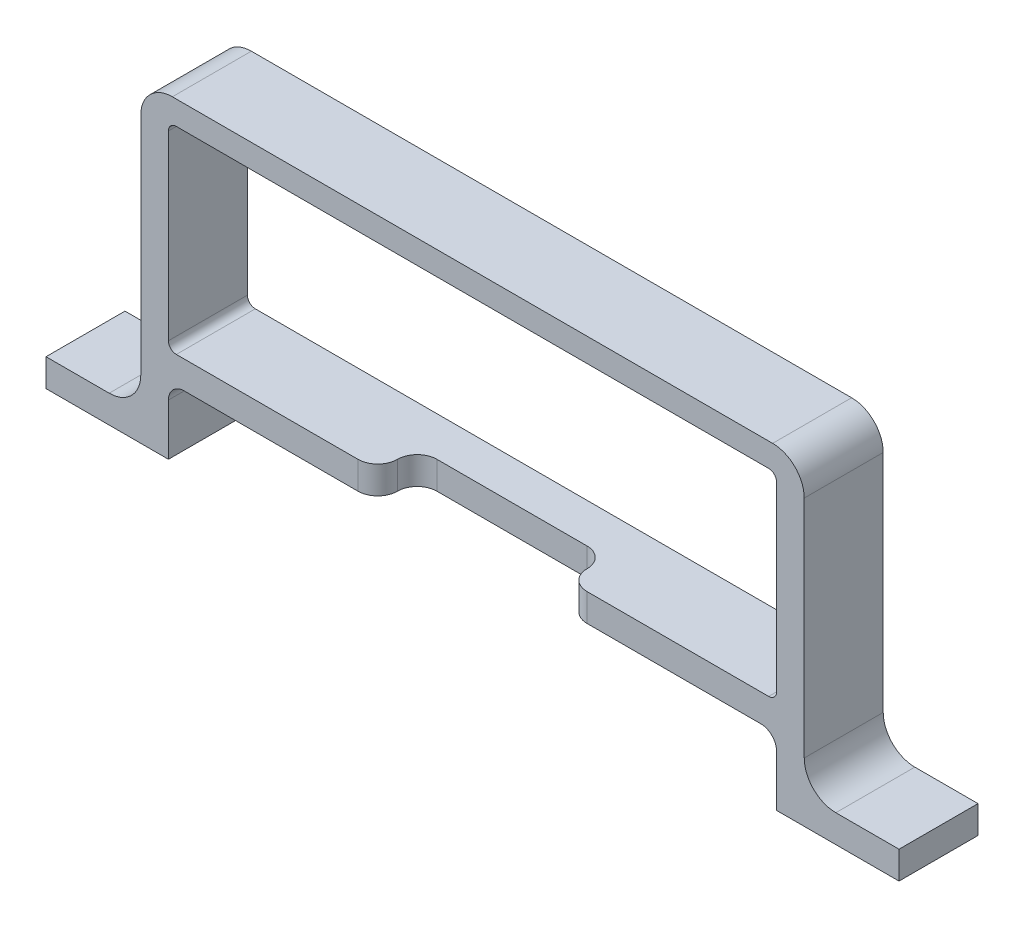
ISO-10303-21;
HEADER;
FILE_DESCRIPTION(('STEP AP214'),'2;1');
FILE_NAME('part.step','',(''),(''),'','','');
FILE_SCHEMA(('AUTOMOTIVE_DESIGN { 1 0 10303 214 1 1 1 1 }'));
ENDSEC;
DATA;
#1=APPLICATION_CONTEXT('core data for automotive mechanical design processes');
#2=APPLICATION_PROTOCOL_DEFINITION('international standard','automotive_design',2000,#1);
#3=PRODUCT_CONTEXT('',#1,'mechanical');
#4=PRODUCT('Part','Part','',(#3));
#5=PRODUCT_RELATED_PRODUCT_CATEGORY('part','',(#4));
#6=PRODUCT_DEFINITION_FORMATION('','',#4);
#7=PRODUCT_DEFINITION_CONTEXT('part definition',#1,'design');
#8=PRODUCT_DEFINITION('design','',#6,#7);
#9=PRODUCT_DEFINITION_SHAPE('','',#8);
#10=(LENGTH_UNIT() NAMED_UNIT(*) SI_UNIT(.MILLI.,.METRE.));
#11=(NAMED_UNIT(*) PLANE_ANGLE_UNIT() SI_UNIT($,.RADIAN.));
#12=(NAMED_UNIT(*) SI_UNIT($,.STERADIAN.) SOLID_ANGLE_UNIT());
#13=UNCERTAINTY_MEASURE_WITH_UNIT(LENGTH_MEASURE(1.E-05),#10,'distance_accuracy_value','');
#14=(GEOMETRIC_REPRESENTATION_CONTEXT(3) GLOBAL_UNCERTAINTY_ASSIGNED_CONTEXT((#13)) GLOBAL_UNIT_ASSIGNED_CONTEXT((#10,
#11,#12)) REPRESENTATION_CONTEXT('',''));
#15=CARTESIAN_POINT('',(0.,0.,0.));
#16=DIRECTION('',(0.,0.,1.));
#17=DIRECTION('',(1.,0.,0.));
#18=AXIS2_PLACEMENT_3D('',#15,#16,#17);
#19=CARTESIAN_POINT('',(-43.1871611587765,0.,10.));
#20=DIRECTION('',(-1.,0.,0.));
#21=DIRECTION('',(0.,0.,1.));
#22=AXIS2_PLACEMENT_3D('',#19,#20,#21);
#23=PLANE('',#22);
#24=DIRECTION('',(0.,1.,0.));
#25=VECTOR('',#24,1.);
#26=CARTESIAN_POINT('',(-43.1871611587765,0.,0.));
#27=LINE('',#26,#25);
#28=CARTESIAN_POINT('',(-43.1871611587765,-4.2455849456596,0.));
#29=VERTEX_POINT('',#28);
#30=CARTESIAN_POINT('',(-43.1871611587765,24.2544150543403,0.));
#31=VERTEX_POINT('',#30);
#32=EDGE_CURVE('E270',#29,#31,#27,.T.);
#33=ORIENTED_EDGE('',*,*,#32,.F.);
#34=DIRECTION('',(0.,0.,-1.));
#35=VECTOR('',#34,1.);
#36=CARTESIAN_POINT('',(-43.1871611587765,-4.2455849456596,10.));
#37=LINE('',#36,#35);
#38=CARTESIAN_POINT('',(-43.1871611587765,-4.2455849456596,10.));
#39=VERTEX_POINT('',#38);
#40=EDGE_CURVE('E381',#39,#29,#37,.T.);
#41=ORIENTED_EDGE('',*,*,#40,.F.);
#42=DIRECTION('',(0.,1.,0.));
#43=VECTOR('',#42,1.);
#44=CARTESIAN_POINT('',(-43.1871611587765,0.,10.));
#45=LINE('',#44,#43);
#46=CARTESIAN_POINT('',(-43.1871611587765,24.2544150543403,10.));
#47=VERTEX_POINT('',#46);
#48=EDGE_CURVE('E279',#39,#47,#45,.T.);
#49=ORIENTED_EDGE('',*,*,#48,.T.);
#50=DIRECTION('',(0.,0.,-1.));
#51=VECTOR('',#50,1.);
#52=CARTESIAN_POINT('',(-43.1871611587765,24.2544150543403,10.));
#53=LINE('',#52,#51);
#54=EDGE_CURVE('E318',#47,#31,#53,.T.);
#55=ORIENTED_EDGE('',*,*,#54,.T.);
#56=EDGE_LOOP('',(#33,#41,#49,#55));
#57=FACE_BOUND('',#56,.T.);
#58=ADVANCED_FACE('F35',(#57),#23,.T.);
#59=CARTESIAN_POINT('',(-47.1871611587765,-4.24558494565963,10.));
#60=DIRECTION('',(0.,0.,-1.));
#61=DIRECTION('',(-1.,0.,0.));
#62=AXIS2_PLACEMENT_3D('',#59,#60,#61);
#63=CYLINDRICAL_SURFACE('',#62,4.);
#64=CARTESIAN_POINT('',(-47.1871611587765,-4.24558494565963,0.));
#65=DIRECTION('',(0.,0.,1.));
#66=DIRECTION('',(1.,0.,0.));
#67=AXIS2_PLACEMENT_3D('',#64,#65,#66);
#68=CIRCLE('',#67,4.);
#69=CARTESIAN_POINT('',(-47.1871611587765,-8.24558494565963,0.));
#70=VERTEX_POINT('',#69);
#71=EDGE_CURVE('E273',#29,#70,#68,.F.);
#72=ORIENTED_EDGE('',*,*,#71,.T.);
#73=DIRECTION('',(0.,0.,-1.));
#74=VECTOR('',#73,1.);
#75=CARTESIAN_POINT('',(-47.1871611587765,-8.24558494565963,10.));
#76=LINE('',#75,#74);
#77=CARTESIAN_POINT('',(-47.1871611587765,-8.24558494565963,10.));
#78=VERTEX_POINT('',#77);
#79=EDGE_CURVE('E378',#78,#70,#76,.T.);
#80=ORIENTED_EDGE('',*,*,#79,.F.);
#81=CARTESIAN_POINT('',(-47.1871611587765,-4.24558494565963,10.));
#82=DIRECTION('',(0.,0.,1.));
#83=DIRECTION('',(1.,0.,0.));
#84=AXIS2_PLACEMENT_3D('',#81,#82,#83);
#85=CIRCLE('',#84,4.);
#86=EDGE_CURVE('E282',#39,#78,#85,.F.);
#87=ORIENTED_EDGE('',*,*,#86,.F.);
#88=ORIENTED_EDGE('',*,*,#40,.T.);
#89=EDGE_LOOP('',(#72,#80,#87,#88));
#90=FACE_BOUND('',#89,.T.);
#91=ADVANCED_FACE('F565',(#90),#63,.F.);
#92=CARTESIAN_POINT('',(0.,-8.24558494565962,10.));
#93=DIRECTION('',(0.,-1.,0.));
#94=DIRECTION('',(1.,0.,0.));
#95=AXIS2_PLACEMENT_3D('',#92,#93,#94);
#96=PLANE('',#95);
#97=DIRECTION('',(-1.,0.,0.));
#98=VECTOR('',#97,1.);
#99=CARTESIAN_POINT('',(0.,-8.24558494565962,0.));
#100=LINE('',#99,#98);
#101=CARTESIAN_POINT('',(-55.1871611587765,-8.24558494565963,0.));
#102=VERTEX_POINT('',#101);
#103=EDGE_CURVE('E321',#70,#102,#100,.T.);
#104=ORIENTED_EDGE('',*,*,#103,.T.);
#105=DIRECTION('',(0.,0.,-1.));
#106=VECTOR('',#105,1.);
#107=CARTESIAN_POINT('',(-55.1871611587765,-8.24558494565963,10.));
#108=LINE('',#107,#106);
#109=CARTESIAN_POINT('',(-55.1871611587765,-8.24558494565963,10.));
#110=VERTEX_POINT('',#109);
#111=EDGE_CURVE('E376',#110,#102,#108,.T.);
#112=ORIENTED_EDGE('',*,*,#111,.F.);
#113=DIRECTION('',(-1.,0.,0.));
#114=VECTOR('',#113,1.);
#115=CARTESIAN_POINT('',(0.,-8.24558494565962,10.));
#116=LINE('',#115,#114);
#117=EDGE_CURVE('E285',#78,#110,#116,.T.);
#118=ORIENTED_EDGE('',*,*,#117,.F.);
#119=ORIENTED_EDGE('',*,*,#79,.T.);
#120=EDGE_LOOP('',(#104,#112,#118,#119));
#121=FACE_BOUND('',#120,.T.);
#122=ADVANCED_FACE('F571',(#121),#96,.F.);
#123=CARTESIAN_POINT('',(-55.1871611587765,1.09410816039594E-13,10.));
#124=DIRECTION('',(-1.,0.,0.));
#125=DIRECTION('',(0.,-1.,0.));
#126=AXIS2_PLACEMENT_3D('',#123,#124,#125);
#127=PLANE('',#126);
#128=DIRECTION('',(0.,1.,0.));
#129=VECTOR('',#128,1.);
#130=CARTESIAN_POINT('',(-55.1871611587765,1.09410816039594E-13,0.));
#131=LINE('',#130,#129);
#132=CARTESIAN_POINT('',(-55.1871611587765,-11.7455849456596,0.));
#133=VERTEX_POINT('',#132);
#134=EDGE_CURVE('E324',#133,#102,#131,.T.);
#135=ORIENTED_EDGE('',*,*,#134,.F.);
#136=DIRECTION('',(0.,0.,-1.));
#137=VECTOR('',#136,1.);
#138=CARTESIAN_POINT('',(-55.1871611587765,-11.7455849456596,10.));
#139=LINE('',#138,#137);
#140=CARTESIAN_POINT('',(-55.1871611587765,-11.7455849456596,10.));
#141=VERTEX_POINT('',#140);
#142=EDGE_CURVE('E374',#141,#133,#139,.T.);
#143=ORIENTED_EDGE('',*,*,#142,.F.);
#144=DIRECTION('',(0.,1.,0.));
#145=VECTOR('',#144,1.);
#146=CARTESIAN_POINT('',(-55.1871611587765,1.09410816039594E-13,10.));
#147=LINE('',#146,#145);
#148=EDGE_CURVE('E287',#141,#110,#147,.T.);
#149=ORIENTED_EDGE('',*,*,#148,.T.);
#150=ORIENTED_EDGE('',*,*,#111,.T.);
#151=EDGE_LOOP('',(#135,#143,#149,#150));
#152=FACE_BOUND('',#151,.T.);
#153=ADVANCED_FACE('F828',(#152),#127,.T.);
#154=CARTESIAN_POINT('',(0.,-11.7455849456596,10.));
#155=DIRECTION('',(0.,-1.,0.));
#156=DIRECTION('',(1.,0.,0.));
#157=AXIS2_PLACEMENT_3D('',#154,#155,#156);
#158=PLANE('',#157);
#159=DIRECTION('',(-1.,0.,0.));
#160=VECTOR('',#159,1.);
#161=CARTESIAN_POINT('',(0.,-11.7455849456596,0.));
#162=LINE('',#161,#160);
#163=CARTESIAN_POINT('',(-39.6871611587765,-11.7455849456596,0.));
#164=VERTEX_POINT('',#163);
#165=EDGE_CURVE('E327',#164,#133,#162,.T.);
#166=ORIENTED_EDGE('',*,*,#165,.F.);
#167=DIRECTION('',(0.,0.,-1.));
#168=VECTOR('',#167,1.);
#169=CARTESIAN_POINT('',(-39.6871611587765,-11.7455849456596,10.));
#170=LINE('',#169,#168);
#171=CARTESIAN_POINT('',(-39.6871611587765,-11.7455849456596,10.));
#172=VERTEX_POINT('',#171);
#173=EDGE_CURVE('E372',#172,#164,#170,.T.);
#174=ORIENTED_EDGE('',*,*,#173,.F.);
#175=DIRECTION('',(-1.,0.,0.));
#176=VECTOR('',#175,1.);
#177=CARTESIAN_POINT('',(0.,-11.7455849456596,10.));
#178=LINE('',#177,#176);
#179=EDGE_CURVE('E290',#172,#141,#178,.T.);
#180=ORIENTED_EDGE('',*,*,#179,.T.);
#181=ORIENTED_EDGE('',*,*,#142,.T.);
#182=EDGE_LOOP('',(#166,#174,#180,#181));
#183=FACE_BOUND('',#182,.T.);
#184=ADVANCED_FACE('F824',(#183),#158,.T.);
#185=CARTESIAN_POINT('',(-39.6871611587765,0.,10.));
#186=DIRECTION('',(1.,0.,0.));
#187=DIRECTION('',(0.,0.,-1.));
#188=AXIS2_PLACEMENT_3D('',#185,#186,#187);
#189=PLANE('',#188);
#190=DIRECTION('',(0.,-1.,0.));
#191=VECTOR('',#190,1.);
#192=CARTESIAN_POINT('',(-39.6871611587765,0.,0.));
#193=LINE('',#192,#191);
#194=CARTESIAN_POINT('',(-39.6871611587765,-5.24558494565964,0.));
#195=VERTEX_POINT('',#194);
#196=EDGE_CURVE('E330',#195,#164,#193,.T.);
#197=ORIENTED_EDGE('',*,*,#196,.F.);
#198=DIRECTION('',(0.,0.,-1.));
#199=VECTOR('',#198,1.);
#200=CARTESIAN_POINT('',(-39.6871611587765,-5.24558494565964,10.));
#201=LINE('',#200,#199);
#202=CARTESIAN_POINT('',(-39.6871611587765,-5.24558494565964,10.));
#203=VERTEX_POINT('',#202);
#204=EDGE_CURVE('E370',#203,#195,#201,.T.);
#205=ORIENTED_EDGE('',*,*,#204,.F.);
#206=DIRECTION('',(0.,-1.,0.));
#207=VECTOR('',#206,1.);
#208=CARTESIAN_POINT('',(-39.6871611587765,0.,10.));
#209=LINE('',#208,#207);
#210=EDGE_CURVE('E293',#203,#172,#209,.T.);
#211=ORIENTED_EDGE('',*,*,#210,.T.);
#212=ORIENTED_EDGE('',*,*,#173,.T.);
#213=EDGE_LOOP('',(#197,#205,#211,#212));
#214=FACE_BOUND('',#213,.T.);
#215=ADVANCED_FACE('F822',(#214),#189,.T.);
#216=CARTESIAN_POINT('',(-37.6871611587765,-5.24558494565963,10.));
#217=DIRECTION('',(0.,0.,-1.));
#218=DIRECTION('',(-1.,0.,0.));
#219=AXIS2_PLACEMENT_3D('',#216,#217,#218);
#220=CYLINDRICAL_SURFACE('',#219,2.);
#221=CARTESIAN_POINT('',(-37.6871611587765,-5.24558494565963,0.));
#222=DIRECTION('',(0.,0.,1.));
#223=DIRECTION('',(1.,0.,0.));
#224=AXIS2_PLACEMENT_3D('',#221,#222,#223);
#225=CIRCLE('',#224,2.);
#226=CARTESIAN_POINT('',(-37.6871611587764,-3.24558494565963,0.));
#227=VERTEX_POINT('',#226);
#228=EDGE_CURVE('E333',#195,#227,#225,.F.);
#229=ORIENTED_EDGE('',*,*,#228,.T.);
#230=DIRECTION('',(0.,0.,-1.));
#231=VECTOR('',#230,1.);
#232=CARTESIAN_POINT('',(-37.6871611587764,-3.24558494565963,10.));
#233=LINE('',#232,#231);
#234=CARTESIAN_POINT('',(-37.6871611587764,-3.24558494565963,10.));
#235=VERTEX_POINT('',#234);
#236=EDGE_CURVE('E367',#235,#227,#233,.T.);
#237=ORIENTED_EDGE('',*,*,#236,.F.);
#238=CARTESIAN_POINT('',(-37.6871611587765,-5.24558494565963,10.));
#239=DIRECTION('',(0.,0.,1.));
#240=DIRECTION('',(1.,0.,0.));
#241=AXIS2_PLACEMENT_3D('',#238,#239,#240);
#242=CIRCLE('',#241,2.);
#243=EDGE_CURVE('E296',#203,#235,#242,.F.);
#244=ORIENTED_EDGE('',*,*,#243,.F.);
#245=ORIENTED_EDGE('',*,*,#204,.T.);
#246=EDGE_LOOP('',(#229,#237,#244,#245));
#247=FACE_BOUND('',#246,.T.);
#248=ADVANCED_FACE('F430',(#247),#220,.F.);
#249=CARTESIAN_POINT('',(0.,-3.24558494565963,10.));
#250=DIRECTION('',(0.,1.,0.));
#251=DIRECTION('',(0.,0.,1.));
#252=AXIS2_PLACEMENT_3D('',#249,#250,#251);
#253=PLANE('',#252);
#254=DIRECTION('',(1.,0.,0.));
#255=VECTOR('',#254,1.);
#256=CARTESIAN_POINT('',(0.,-3.24558494565963,10.));
#257=LINE('',#256,#255);
#258=CARTESIAN_POINT('',(13.3128388412235,-3.24558494565963,10.));
#259=VERTEX_POINT('',#258);
#260=CARTESIAN_POINT('',(35.3128388412235,-3.24558494565963,10.));
#261=VERTEX_POINT('',#260);
#262=EDGE_CURVE('E298',#259,#261,#257,.T.);
#263=ORIENTED_EDGE('',*,*,#262,.F.);
#264=CARTESIAN_POINT('',(13.3128388412235,-3.24558494565963,7.5));
#265=DIRECTION('',(0.,1.,0.));
#266=DIRECTION('',(0.,0.,1.));
#267=AXIS2_PLACEMENT_3D('',#264,#265,#266);
#268=CIRCLE('',#267,2.5);
#269=CARTESIAN_POINT('',(10.8128388412235,-3.24558494565963,7.5));
#270=VERTEX_POINT('',#269);
#271=EDGE_CURVE('E52',#259,#270,#268,.F.);
#272=ORIENTED_EDGE('',*,*,#271,.T.);
#273=CARTESIAN_POINT('',(8.31283884122354,-3.24558494565963,7.5));
#274=DIRECTION('',(0.,1.,0.));
#275=DIRECTION('',(0.,0.,1.));
#276=AXIS2_PLACEMENT_3D('',#273,#274,#275);
#277=CIRCLE('',#276,2.5);
#278=CARTESIAN_POINT('',(8.31283884122354,-3.24558494565963,5.));
#279=VERTEX_POINT('',#278);
#280=EDGE_CURVE('E402',#270,#279,#277,.T.);
#281=ORIENTED_EDGE('',*,*,#280,.T.);
#282=DIRECTION('',(1.,0.,0.));
#283=VECTOR('',#282,1.);
#284=CARTESIAN_POINT('',(0.,-3.24558494565963,5.));
#285=LINE('',#284,#283);
#286=CARTESIAN_POINT('',(-10.6871611587765,-3.24558494565963,5.));
#287=VERTEX_POINT('',#286);
#288=EDGE_CURVE('E411',#287,#279,#285,.T.);
#289=ORIENTED_EDGE('',*,*,#288,.F.);
#290=CARTESIAN_POINT('',(-10.6871611587765,-3.24558494565963,7.5));
#291=DIRECTION('',(0.,1.,0.));
#292=DIRECTION('',(0.,0.,1.));
#293=AXIS2_PLACEMENT_3D('',#290,#291,#292);
#294=CIRCLE('',#293,2.5);
#295=CARTESIAN_POINT('',(-13.1871611587765,-3.24558494565963,7.5));
#296=VERTEX_POINT('',#295);
#297=EDGE_CURVE('E44',#287,#296,#294,.T.);
#298=ORIENTED_EDGE('',*,*,#297,.T.);
#299=CARTESIAN_POINT('',(-15.6871611587765,-3.24558494565963,7.5));
#300=DIRECTION('',(0.,1.,0.));
#301=DIRECTION('',(0.,0.,1.));
#302=AXIS2_PLACEMENT_3D('',#299,#300,#301);
#303=CIRCLE('',#302,2.5);
#304=CARTESIAN_POINT('',(-15.6871611587765,-3.24558494565963,10.));
#305=VERTEX_POINT('',#304);
#306=EDGE_CURVE('E392',#296,#305,#303,.F.);
#307=ORIENTED_EDGE('',*,*,#306,.T.);
#308=EDGE_CURVE('E299',#235,#305,#257,.T.);
#309=ORIENTED_EDGE('',*,*,#308,.F.);
#310=ORIENTED_EDGE('',*,*,#236,.T.);
#311=DIRECTION('',(1.,0.,0.));
#312=VECTOR('',#311,1.);
#313=CARTESIAN_POINT('',(0.,-3.24558494565963,0.));
#314=LINE('',#313,#312);
#315=CARTESIAN_POINT('',(35.3128388412235,-3.24558494565963,0.));
#316=VERTEX_POINT('',#315);
#317=EDGE_CURVE('E335',#227,#316,#314,.T.);
#318=ORIENTED_EDGE('',*,*,#317,.T.);
#319=DIRECTION('',(0.,0.,-1.));
#320=VECTOR('',#319,1.);
#321=CARTESIAN_POINT('',(35.3128388412235,-3.24558494565963,10.));
#322=LINE('',#321,#320);
#323=EDGE_CURVE('E478',#261,#316,#322,.T.);
#324=ORIENTED_EDGE('',*,*,#323,.F.);
#325=EDGE_LOOP('',(#263,#272,#281,#289,#298,#307,#309,#310,#318,#324));
#326=FACE_BOUND('',#325,.T.);
#327=ADVANCED_FACE('F423',(#326),#253,.F.);
#328=CARTESIAN_POINT('',(0.,0.25441505434037,10.));
#329=DIRECTION('',(0.,-1.,0.));
#330=DIRECTION('',(0.,0.,-1.));
#331=AXIS2_PLACEMENT_3D('',#328,#329,#330);
#332=PLANE('',#331);
#333=DIRECTION('',(-1.,0.,0.));
#334=VECTOR('',#333,1.);
#335=CARTESIAN_POINT('',(10.8128388412235,0.25441505434037,5.));
#336=LINE('',#335,#334);
#337=CARTESIAN_POINT('',(8.31283884122354,0.25441505434037,5.));
#338=VERTEX_POINT('',#337);
#339=CARTESIAN_POINT('',(-10.6871611587765,0.25441505434037,5.));
#340=VERTEX_POINT('',#339);
#341=EDGE_CURVE('E406',#338,#340,#336,.T.);
#342=ORIENTED_EDGE('',*,*,#341,.F.);
#343=CARTESIAN_POINT('',(8.31283884122354,0.25441505434037,7.5));
#344=DIRECTION('',(0.,-1.,0.));
#345=DIRECTION('',(0.,0.,-1.));
#346=AXIS2_PLACEMENT_3D('',#343,#344,#345);
#347=CIRCLE('',#346,2.5);
#348=CARTESIAN_POINT('',(10.8128388412235,0.25441505434037,7.5));
#349=VERTEX_POINT('',#348);
#350=EDGE_CURVE('E400',#338,#349,#347,.T.);
#351=ORIENTED_EDGE('',*,*,#350,.T.);
#352=CARTESIAN_POINT('',(13.3128388412235,0.25441505434037,7.5));
#353=DIRECTION('',(0.,-1.,0.));
#354=DIRECTION('',(0.,0.,-1.));
#355=AXIS2_PLACEMENT_3D('',#352,#353,#354);
#356=CIRCLE('',#355,2.5);
#357=CARTESIAN_POINT('',(13.3128388412235,0.25441505434037,10.));
#358=VERTEX_POINT('',#357);
#359=EDGE_CURVE('E385',#349,#358,#356,.F.);
#360=ORIENTED_EDGE('',*,*,#359,.T.);
#361=DIRECTION('',(-1.,0.,0.));
#362=VECTOR('',#361,1.);
#363=CARTESIAN_POINT('',(0.,0.25441505434037,10.));
#364=LINE('',#363,#362);
#365=CARTESIAN_POINT('',(36.3128388412235,0.25441505434037,10.));
#366=VERTEX_POINT('',#365);
#367=EDGE_CURVE('E303',#366,#358,#364,.T.);
#368=ORIENTED_EDGE('',*,*,#367,.F.);
#369=DIRECTION('',(0.,0.,-1.));
#370=VECTOR('',#369,1.);
#371=CARTESIAN_POINT('',(36.3128388412235,0.25441505434037,10.));
#372=LINE('',#371,#370);
#373=CARTESIAN_POINT('',(36.3128388412235,0.25441505434037,0.));
#374=VERTEX_POINT('',#373);
#375=EDGE_CURVE('E480',#366,#374,#372,.T.);
#376=ORIENTED_EDGE('',*,*,#375,.T.);
#377=DIRECTION('',(-1.,0.,0.));
#378=VECTOR('',#377,1.);
#379=CARTESIAN_POINT('',(0.,0.25441505434037,0.));
#380=LINE('',#379,#378);
#381=CARTESIAN_POINT('',(-38.6871611587765,0.25441505434037,0.));
#382=VERTEX_POINT('',#381);
#383=EDGE_CURVE('E337',#374,#382,#380,.T.);
#384=ORIENTED_EDGE('',*,*,#383,.T.);
#385=DIRECTION('',(0.,0.,-1.));
#386=VECTOR('',#385,1.);
#387=CARTESIAN_POINT('',(-38.6871611587765,0.25441505434037,10.));
#388=LINE('',#387,#386);
#389=CARTESIAN_POINT('',(-38.6871611587765,0.25441505434037,10.));
#390=VERTEX_POINT('',#389);
#391=EDGE_CURVE('E365',#390,#382,#388,.T.);
#392=ORIENTED_EDGE('',*,*,#391,.F.);
#393=CARTESIAN_POINT('',(-15.6871611587765,0.25441505434037,10.));
#394=VERTEX_POINT('',#393);
#395=EDGE_CURVE('E302',#394,#390,#364,.T.);
#396=ORIENTED_EDGE('',*,*,#395,.F.);
#397=CARTESIAN_POINT('',(-15.6871611587765,0.25441505434037,7.5));
#398=DIRECTION('',(0.,-1.,0.));
#399=DIRECTION('',(0.,0.,-1.));
#400=AXIS2_PLACEMENT_3D('',#397,#398,#399);
#401=CIRCLE('',#400,2.5);
#402=CARTESIAN_POINT('',(-13.1871611587765,0.25441505434037,7.5));
#403=VERTEX_POINT('',#402);
#404=EDGE_CURVE('E383',#394,#403,#401,.F.);
#405=ORIENTED_EDGE('',*,*,#404,.T.);
#406=CARTESIAN_POINT('',(-10.6871611587765,0.25441505434037,7.5));
#407=DIRECTION('',(0.,-1.,0.));
#408=DIRECTION('',(0.,0.,-1.));
#409=AXIS2_PLACEMENT_3D('',#406,#407,#408);
#410=CIRCLE('',#409,2.5);
#411=EDGE_CURVE('E11',#403,#340,#410,.T.);
#412=ORIENTED_EDGE('',*,*,#411,.T.);
#413=EDGE_LOOP('',(#342,#351,#360,#368,#376,#384,#392,#396,#405,#412));
#414=FACE_BOUND('',#413,.T.);
#415=ADVANCED_FACE('F536',(#414),#332,.F.);
#416=CARTESIAN_POINT('',(-38.6871611587765,1.25441505434037,10.));
#417=DIRECTION('',(0.,0.,-1.));
#418=DIRECTION('',(-1.,0.,0.));
#419=AXIS2_PLACEMENT_3D('',#416,#417,#418);
#420=CYLINDRICAL_SURFACE('',#419,1.);
#421=CARTESIAN_POINT('',(-38.6871611587765,1.25441505434037,0.));
#422=DIRECTION('',(0.,0.,1.));
#423=DIRECTION('',(1.,0.,0.));
#424=AXIS2_PLACEMENT_3D('',#421,#422,#423);
#425=CIRCLE('',#424,1.);
#426=CARTESIAN_POINT('',(-39.6871611587765,1.25441505434037,0.));
#427=VERTEX_POINT('',#426);
#428=EDGE_CURVE('E340',#427,#382,#425,.T.);
#429=ORIENTED_EDGE('',*,*,#428,.F.);
#430=DIRECTION('',(0.,0.,-1.));
#431=VECTOR('',#430,1.);
#432=CARTESIAN_POINT('',(-39.6871611587765,1.25441505434037,10.));
#433=LINE('',#432,#431);
#434=CARTESIAN_POINT('',(-39.6871611587765,1.25441505434037,10.));
#435=VERTEX_POINT('',#434);
#436=EDGE_CURVE('E363',#435,#427,#433,.T.);
#437=ORIENTED_EDGE('',*,*,#436,.F.);
#438=CARTESIAN_POINT('',(-38.6871611587765,1.25441505434037,10.));
#439=DIRECTION('',(0.,0.,1.));
#440=DIRECTION('',(1.,0.,0.));
#441=AXIS2_PLACEMENT_3D('',#438,#439,#440);
#442=CIRCLE('',#441,1.);
#443=EDGE_CURVE('E305',#435,#390,#442,.T.);
#444=ORIENTED_EDGE('',*,*,#443,.T.);
#445=ORIENTED_EDGE('',*,*,#391,.T.);
#446=EDGE_LOOP('',(#429,#437,#444,#445));
#447=FACE_BOUND('',#446,.T.);
#448=ADVANCED_FACE('F543',(#447),#420,.F.);
#449=CARTESIAN_POINT('',(-39.6871611587765,0.,10.));
#450=DIRECTION('',(-1.,0.,0.));
#451=DIRECTION('',(0.,0.,1.));
#452=AXIS2_PLACEMENT_3D('',#449,#450,#451);
#453=PLANE('',#452);
#454=DIRECTION('',(0.,1.,0.));
#455=VECTOR('',#454,1.);
#456=CARTESIAN_POINT('',(-39.6871611587765,0.,0.));
#457=LINE('',#456,#455);
#458=CARTESIAN_POINT('',(-39.6871611587765,24.2544150543404,0.));
#459=VERTEX_POINT('',#458);
#460=EDGE_CURVE('E343',#427,#459,#457,.T.);
#461=ORIENTED_EDGE('',*,*,#460,.T.);
#462=DIRECTION('',(0.,0.,-1.));
#463=VECTOR('',#462,1.);
#464=CARTESIAN_POINT('',(-39.6871611587765,24.2544150543404,10.));
#465=LINE('',#464,#463);
#466=CARTESIAN_POINT('',(-39.6871611587765,24.2544150543404,10.));
#467=VERTEX_POINT('',#466);
#468=EDGE_CURVE('E360',#467,#459,#465,.T.);
#469=ORIENTED_EDGE('',*,*,#468,.F.);
#470=DIRECTION('',(0.,1.,0.));
#471=VECTOR('',#470,1.);
#472=CARTESIAN_POINT('',(-39.6871611587765,0.,10.));
#473=LINE('',#472,#471);
#474=EDGE_CURVE('E308',#435,#467,#473,.T.);
#475=ORIENTED_EDGE('',*,*,#474,.F.);
#476=ORIENTED_EDGE('',*,*,#436,.T.);
#477=EDGE_LOOP('',(#461,#469,#475,#476));
#478=FACE_BOUND('',#477,.T.);
#479=ADVANCED_FACE('F546',(#478),#453,.F.);
#480=CARTESIAN_POINT('',(-38.6871611587765,24.2544150543404,10.));
#481=DIRECTION('',(0.,0.,-1.));
#482=DIRECTION('',(-1.,0.,0.));
#483=AXIS2_PLACEMENT_3D('',#480,#481,#482);
#484=CYLINDRICAL_SURFACE('',#483,1.);
#485=CARTESIAN_POINT('',(-38.6871611587765,24.2544150543404,0.));
#486=DIRECTION('',(0.,0.,1.));
#487=DIRECTION('',(1.,0.,0.));
#488=AXIS2_PLACEMENT_3D('',#485,#486,#487);
#489=CIRCLE('',#488,1.);
#490=CARTESIAN_POINT('',(-38.6871611587765,25.2544150543404,0.));
#491=VERTEX_POINT('',#490);
#492=EDGE_CURVE('E345',#459,#491,#489,.F.);
#493=ORIENTED_EDGE('',*,*,#492,.T.);
#494=DIRECTION('',(0.,0.,-1.));
#495=VECTOR('',#494,1.);
#496=CARTESIAN_POINT('',(-38.6871611587765,25.2544150543404,10.));
#497=LINE('',#496,#495);
#498=CARTESIAN_POINT('',(-38.6871611587765,25.2544150543404,10.));
#499=VERTEX_POINT('',#498);
#500=EDGE_CURVE('E357',#499,#491,#497,.T.);
#501=ORIENTED_EDGE('',*,*,#500,.F.);
#502=CARTESIAN_POINT('',(-38.6871611587765,24.2544150543404,10.));
#503=DIRECTION('',(0.,0.,1.));
#504=DIRECTION('',(1.,0.,0.));
#505=AXIS2_PLACEMENT_3D('',#502,#503,#504);
#506=CIRCLE('',#505,1.);
#507=EDGE_CURVE('E310',#467,#499,#506,.F.);
#508=ORIENTED_EDGE('',*,*,#507,.F.);
#509=ORIENTED_EDGE('',*,*,#468,.T.);
#510=EDGE_LOOP('',(#493,#501,#508,#509));
#511=FACE_BOUND('',#510,.T.);
#512=ADVANCED_FACE('F550',(#511),#484,.F.);
#513=CARTESIAN_POINT('',(0.,25.2544150543404,10.));
#514=DIRECTION('',(0.,1.,0.));
#515=DIRECTION('',(0.,0.,1.));
#516=AXIS2_PLACEMENT_3D('',#513,#514,#515);
#517=PLANE('',#516);
#518=DIRECTION('',(1.,0.,0.));
#519=VECTOR('',#518,1.);
#520=CARTESIAN_POINT('',(0.,25.2544150543404,0.));
#521=LINE('',#520,#519);
#522=CARTESIAN_POINT('',(36.3128388412235,25.2544150543404,0.));
#523=VERTEX_POINT('',#522);
#524=EDGE_CURVE('E347',#491,#523,#521,.T.);
#525=ORIENTED_EDGE('',*,*,#524,.T.);
#526=DIRECTION('',(0.,0.,-1.));
#527=VECTOR('',#526,1.);
#528=CARTESIAN_POINT('',(36.3128388412235,25.2544150543404,10.));
#529=LINE('',#528,#527);
#530=CARTESIAN_POINT('',(36.3128388412235,25.2544150543404,10.));
#531=VERTEX_POINT('',#530);
#532=EDGE_CURVE('E275',#531,#523,#529,.T.);
#533=ORIENTED_EDGE('',*,*,#532,.F.);
#534=DIRECTION('',(1.,0.,0.));
#535=VECTOR('',#534,1.);
#536=CARTESIAN_POINT('',(0.,25.2544150543404,10.));
#537=LINE('',#536,#535);
#538=EDGE_CURVE('E312',#499,#531,#537,.T.);
#539=ORIENTED_EDGE('',*,*,#538,.F.);
#540=ORIENTED_EDGE('',*,*,#500,.T.);
#541=EDGE_LOOP('',(#525,#533,#539,#540));
#542=FACE_BOUND('',#541,.T.);
#543=ADVANCED_FACE('F552',(#542),#517,.F.);
#544=CARTESIAN_POINT('',(0.,28.2544150543404,10.));
#545=DIRECTION('',(0.,-1.,0.));
#546=DIRECTION('',(0.,0.,-1.));
#547=AXIS2_PLACEMENT_3D('',#544,#545,#546);
#548=PLANE('',#547);
#549=DIRECTION('',(-1.,0.,0.));
#550=VECTOR('',#549,1.);
#551=CARTESIAN_POINT('',(0.,28.2544150543404,0.));
#552=LINE('',#551,#550);
#553=CARTESIAN_POINT('',(36.8128388412235,28.2544150543404,0.));
#554=VERTEX_POINT('',#553);
#555=CARTESIAN_POINT('',(-39.1871611587764,28.2544150543404,0.));
#556=VERTEX_POINT('',#555);
#557=EDGE_CURVE('E349',#554,#556,#552,.T.);
#558=ORIENTED_EDGE('',*,*,#557,.T.);
#559=DIRECTION('',(0.,0.,-1.));
#560=VECTOR('',#559,1.);
#561=CARTESIAN_POINT('',(-39.1871611587764,28.2544150543404,10.));
#562=LINE('',#561,#560);
#563=CARTESIAN_POINT('',(-39.1871611587764,28.2544150543404,10.));
#564=VERTEX_POINT('',#563);
#565=EDGE_CURVE('E355',#564,#556,#562,.T.);
#566=ORIENTED_EDGE('',*,*,#565,.F.);
#567=DIRECTION('',(-1.,0.,0.));
#568=VECTOR('',#567,1.);
#569=CARTESIAN_POINT('',(0.,28.2544150543404,10.));
#570=LINE('',#569,#568);
#571=CARTESIAN_POINT('',(36.8128388412235,28.2544150543404,10.));
#572=VERTEX_POINT('',#571);
#573=EDGE_CURVE('E314',#572,#564,#570,.T.);
#574=ORIENTED_EDGE('',*,*,#573,.F.);
#575=DIRECTION('',(0.,0.,-1.));
#576=VECTOR('',#575,1.);
#577=CARTESIAN_POINT('',(36.8128388412235,28.2544150543404,10.));
#578=LINE('',#577,#576);
#579=EDGE_CURVE('E252',#572,#554,#578,.T.);
#580=ORIENTED_EDGE('',*,*,#579,.T.);
#581=EDGE_LOOP('',(#558,#566,#574,#580));
#582=FACE_BOUND('',#581,.T.);
#583=ADVANCED_FACE('F554',(#582),#548,.F.);
#584=CARTESIAN_POINT('',(-39.1871611587765,24.2544150543404,10.));
#585=DIRECTION('',(0.,0.,-1.));
#586=DIRECTION('',(-1.,0.,0.));
#587=AXIS2_PLACEMENT_3D('',#584,#585,#586);
#588=CYLINDRICAL_SURFACE('',#587,4.);
#589=CARTESIAN_POINT('',(-39.1871611587765,24.2544150543404,0.));
#590=DIRECTION('',(0.,0.,1.));
#591=DIRECTION('',(1.,0.,0.));
#592=AXIS2_PLACEMENT_3D('',#589,#590,#591);
#593=CIRCLE('',#592,4.);
#594=EDGE_CURVE('E283',#31,#556,#593,.F.);
#595=ORIENTED_EDGE('',*,*,#594,.F.);
#596=ORIENTED_EDGE('',*,*,#54,.F.);
#597=CARTESIAN_POINT('',(-39.1871611587765,24.2544150543404,10.));
#598=DIRECTION('',(0.,0.,1.));
#599=DIRECTION('',(1.,0.,0.));
#600=AXIS2_PLACEMENT_3D('',#597,#598,#599);
#601=CIRCLE('',#600,4.);
#602=EDGE_CURVE('E316',#47,#564,#601,.F.);
#603=ORIENTED_EDGE('',*,*,#602,.T.);
#604=ORIENTED_EDGE('',*,*,#565,.T.);
#605=EDGE_LOOP('',(#595,#596,#603,#604));
#606=FACE_BOUND('',#605,.T.);
#607=ADVANCED_FACE('F560',(#606),#588,.T.);
#608=CARTESIAN_POINT('',(0.,0.,10.));
#609=DIRECTION('',(0.,0.,1.));
#610=DIRECTION('',(1.,0.,0.));
#611=AXIS2_PLACEMENT_3D('',#608,#609,#610);
#612=PLANE('',#611);
#613=ORIENTED_EDGE('',*,*,#367,.T.);
#614=DIRECTION('',(0.,1.,0.));
#615=VECTOR('',#614,1.);
#616=CARTESIAN_POINT('',(13.3128388412235,-3.24558494565963,10.));
#617=LINE('',#616,#615);
#618=EDGE_CURVE('E389',#358,#259,#617,.F.);
#619=ORIENTED_EDGE('',*,*,#618,.T.);
#620=ORIENTED_EDGE('',*,*,#262,.T.);
#621=CARTESIAN_POINT('',(35.3128388412235,-5.24558494565963,10.));
#622=DIRECTION('',(0.,0.,-1.));
#623=DIRECTION('',(-1.,0.,0.));
#624=AXIS2_PLACEMENT_3D('',#621,#622,#623);
#625=CIRCLE('',#624,2.);
#626=CARTESIAN_POINT('',(37.3128388412235,-5.24558494565964,10.));
#627=VERTEX_POINT('',#626);
#628=EDGE_CURVE('E517',#627,#261,#625,.F.);
#629=ORIENTED_EDGE('',*,*,#628,.F.);
#630=DIRECTION('',(0.,-1.,0.));
#631=VECTOR('',#630,1.);
#632=CARTESIAN_POINT('',(37.3128388412235,0.,10.));
#633=LINE('',#632,#631);
#634=CARTESIAN_POINT('',(37.3128388412235,-11.7455849456596,10.));
#635=VERTEX_POINT('',#634);
#636=EDGE_CURVE('E515',#627,#635,#633,.T.);
#637=ORIENTED_EDGE('',*,*,#636,.T.);
#638=DIRECTION('',(1.,0.,0.));
#639=VECTOR('',#638,1.);
#640=CARTESIAN_POINT('',(-2.37432231755293,-11.7455849456596,10.));
#641=LINE('',#640,#639);
#642=CARTESIAN_POINT('',(52.8128388412236,-11.7455849456596,10.));
#643=VERTEX_POINT('',#642);
#644=EDGE_CURVE('E513',#635,#643,#641,.T.);
#645=ORIENTED_EDGE('',*,*,#644,.T.);
#646=DIRECTION('',(0.,1.,0.));
#647=VECTOR('',#646,1.);
#648=CARTESIAN_POINT('',(52.8128388412235,1.09410816039594E-13,10.));
#649=LINE('',#648,#647);
#650=CARTESIAN_POINT('',(52.8128388412235,-8.24558494565963,10.));
#651=VERTEX_POINT('',#650);
#652=EDGE_CURVE('E511',#643,#651,#649,.T.);
#653=ORIENTED_EDGE('',*,*,#652,.T.);
#654=DIRECTION('',(1.,0.,0.));
#655=VECTOR('',#654,1.);
#656=CARTESIAN_POINT('',(-2.37432231755293,-8.24558494565962,10.));
#657=LINE('',#656,#655);
#658=CARTESIAN_POINT('',(44.8128388412236,-8.24558494565963,10.));
#659=VERTEX_POINT('',#658);
#660=EDGE_CURVE('E508',#659,#651,#657,.T.);
#661=ORIENTED_EDGE('',*,*,#660,.F.);
#662=CARTESIAN_POINT('',(44.8128388412235,-4.24558494565963,10.));
#663=DIRECTION('',(0.,0.,-1.));
#664=DIRECTION('',(-1.,0.,0.));
#665=AXIS2_PLACEMENT_3D('',#662,#663,#664);
#666=CIRCLE('',#665,4.);
#667=CARTESIAN_POINT('',(40.8128388412235,-4.2455849456596,10.));
#668=VERTEX_POINT('',#667);
#669=EDGE_CURVE('E263',#668,#659,#666,.F.);
#670=ORIENTED_EDGE('',*,*,#669,.F.);
#671=DIRECTION('',(0.,1.,0.));
#672=VECTOR('',#671,1.);
#673=CARTESIAN_POINT('',(40.8128388412235,0.,10.));
#674=LINE('',#673,#672);
#675=CARTESIAN_POINT('',(40.8128388412235,24.2544150543403,10.));
#676=VERTEX_POINT('',#675);
#677=EDGE_CURVE('E255',#668,#676,#674,.T.);
#678=ORIENTED_EDGE('',*,*,#677,.T.);
#679=CARTESIAN_POINT('',(36.8128388412235,24.2544150543404,10.));
#680=DIRECTION('',(0.,0.,-1.));
#681=DIRECTION('',(-1.,0.,0.));
#682=AXIS2_PLACEMENT_3D('',#679,#680,#681);
#683=CIRCLE('',#682,4.);
#684=EDGE_CURVE('E244',#676,#572,#683,.F.);
#685=ORIENTED_EDGE('',*,*,#684,.T.);
#686=ORIENTED_EDGE('',*,*,#573,.T.);
#687=ORIENTED_EDGE('',*,*,#602,.F.);
#688=ORIENTED_EDGE('',*,*,#48,.F.);
#689=ORIENTED_EDGE('',*,*,#86,.T.);
#690=ORIENTED_EDGE('',*,*,#117,.T.);
#691=ORIENTED_EDGE('',*,*,#148,.F.);
#692=ORIENTED_EDGE('',*,*,#179,.F.);
#693=ORIENTED_EDGE('',*,*,#210,.F.);
#694=ORIENTED_EDGE('',*,*,#243,.T.);
#695=ORIENTED_EDGE('',*,*,#308,.T.);
#696=DIRECTION('',(0.,-1.,0.));
#697=VECTOR('',#696,1.);
#698=CARTESIAN_POINT('',(-15.6871611587765,0.25441505434037,10.));
#699=LINE('',#698,#697);
#700=EDGE_CURVE('E387',#305,#394,#699,.F.);
#701=ORIENTED_EDGE('',*,*,#700,.T.);
#702=ORIENTED_EDGE('',*,*,#395,.T.);
#703=ORIENTED_EDGE('',*,*,#443,.F.);
#704=ORIENTED_EDGE('',*,*,#474,.T.);
#705=ORIENTED_EDGE('',*,*,#507,.T.);
#706=ORIENTED_EDGE('',*,*,#538,.T.);
#707=CARTESIAN_POINT('',(36.3128388412235,24.2544150543404,10.));
#708=DIRECTION('',(0.,0.,-1.));
#709=DIRECTION('',(-1.,0.,0.));
#710=AXIS2_PLACEMENT_3D('',#707,#708,#709);
#711=CIRCLE('',#710,1.);
#712=CARTESIAN_POINT('',(37.3128388412235,24.2544150543404,10.));
#713=VERTEX_POINT('',#712);
#714=EDGE_CURVE('E254',#713,#531,#711,.F.);
#715=ORIENTED_EDGE('',*,*,#714,.F.);
#716=DIRECTION('',(0.,1.,0.));
#717=VECTOR('',#716,1.);
#718=CARTESIAN_POINT('',(37.3128388412235,0.,10.));
#719=LINE('',#718,#717);
#720=CARTESIAN_POINT('',(37.3128388412235,1.25441505434037,10.));
#721=VERTEX_POINT('',#720);
#722=EDGE_CURVE('E523',#721,#713,#719,.T.);
#723=ORIENTED_EDGE('',*,*,#722,.F.);
#724=CARTESIAN_POINT('',(36.3128388412235,1.25441505434037,10.));
#725=DIRECTION('',(0.,0.,-1.));
#726=DIRECTION('',(-1.,0.,0.));
#727=AXIS2_PLACEMENT_3D('',#724,#725,#726);
#728=CIRCLE('',#727,1.);
#729=EDGE_CURVE('E520',#721,#366,#728,.T.);
#730=ORIENTED_EDGE('',*,*,#729,.T.);
#731=EDGE_LOOP('',(#613,#619,#620,#629,#637,#645,#653,#661,#670,#678,#685,#686,#687,#688,#689,
#690,#691,#692,#693,#694,#695,#701,#702,#703,#704,#705,#706,#715,#723,#730));
#732=FACE_BOUND('',#731,.T.);
#733=ADVANCED_FACE('F260',(#732),#612,.T.);
#734=CARTESIAN_POINT('',(0.,0.,0.));
#735=DIRECTION('',(0.,0.,1.));
#736=DIRECTION('',(1.,0.,0.));
#737=AXIS2_PLACEMENT_3D('',#734,#735,#736);
#738=PLANE('',#737);
#739=ORIENTED_EDGE('',*,*,#557,.F.);
#740=CARTESIAN_POINT('',(36.8128388412235,24.2544150543404,0.));
#741=DIRECTION('',(0.,0.,-1.));
#742=DIRECTION('',(-1.,0.,0.));
#743=AXIS2_PLACEMENT_3D('',#740,#741,#742);
#744=CIRCLE('',#743,4.);
#745=CARTESIAN_POINT('',(40.8128388412235,24.2544150543403,0.));
#746=VERTEX_POINT('',#745);
#747=EDGE_CURVE('E502',#746,#554,#744,.F.);
#748=ORIENTED_EDGE('',*,*,#747,.F.);
#749=DIRECTION('',(0.,1.,0.));
#750=VECTOR('',#749,1.);
#751=CARTESIAN_POINT('',(40.8128388412235,0.,0.));
#752=LINE('',#751,#750);
#753=CARTESIAN_POINT('',(40.8128388412235,-4.2455849456596,0.));
#754=VERTEX_POINT('',#753);
#755=EDGE_CURVE('E269',#754,#746,#752,.T.);
#756=ORIENTED_EDGE('',*,*,#755,.F.);
#757=CARTESIAN_POINT('',(44.8128388412235,-4.24558494565963,0.));
#758=DIRECTION('',(0.,0.,-1.));
#759=DIRECTION('',(-1.,0.,0.));
#760=AXIS2_PLACEMENT_3D('',#757,#758,#759);
#761=CIRCLE('',#760,4.);
#762=CARTESIAN_POINT('',(44.8128388412236,-8.24558494565963,0.));
#763=VERTEX_POINT('',#762);
#764=EDGE_CURVE('E265',#754,#763,#761,.F.);
#765=ORIENTED_EDGE('',*,*,#764,.T.);
#766=DIRECTION('',(1.,0.,0.));
#767=VECTOR('',#766,1.);
#768=CARTESIAN_POINT('',(-2.37432231755293,-8.24558494565962,0.));
#769=LINE('',#768,#767);
#770=CARTESIAN_POINT('',(52.8128388412235,-8.24558494565963,0.));
#771=VERTEX_POINT('',#770);
#772=EDGE_CURVE('E459',#763,#771,#769,.T.);
#773=ORIENTED_EDGE('',*,*,#772,.T.);
#774=DIRECTION('',(0.,1.,0.));
#775=VECTOR('',#774,1.);
#776=CARTESIAN_POINT('',(52.8128388412235,1.09410816039594E-13,0.));
#777=LINE('',#776,#775);
#778=CARTESIAN_POINT('',(52.8128388412236,-11.7455849456596,0.));
#779=VERTEX_POINT('',#778);
#780=EDGE_CURVE('E456',#779,#771,#777,.T.);
#781=ORIENTED_EDGE('',*,*,#780,.F.);
#782=DIRECTION('',(1.,0.,0.));
#783=VECTOR('',#782,1.);
#784=CARTESIAN_POINT('',(-2.37432231755293,-11.7455849456596,0.));
#785=LINE('',#784,#783);
#786=CARTESIAN_POINT('',(37.3128388412235,-11.7455849456596,0.));
#787=VERTEX_POINT('',#786);
#788=EDGE_CURVE('E448',#787,#779,#785,.T.);
#789=ORIENTED_EDGE('',*,*,#788,.F.);
#790=DIRECTION('',(0.,-1.,0.));
#791=VECTOR('',#790,1.);
#792=CARTESIAN_POINT('',(37.3128388412235,0.,0.));
#793=LINE('',#792,#791);
#794=CARTESIAN_POINT('',(37.3128388412235,-5.24558494565964,0.));
#795=VERTEX_POINT('',#794);
#796=EDGE_CURVE('E444',#795,#787,#793,.T.);
#797=ORIENTED_EDGE('',*,*,#796,.F.);
#798=CARTESIAN_POINT('',(35.3128388412235,-5.24558494565963,0.));
#799=DIRECTION('',(0.,0.,-1.));
#800=DIRECTION('',(-1.,0.,0.));
#801=AXIS2_PLACEMENT_3D('',#798,#799,#800);
#802=CIRCLE('',#801,2.);
#803=EDGE_CURVE('E442',#795,#316,#802,.F.);
#804=ORIENTED_EDGE('',*,*,#803,.T.);
#805=ORIENTED_EDGE('',*,*,#317,.F.);
#806=ORIENTED_EDGE('',*,*,#228,.F.);
#807=ORIENTED_EDGE('',*,*,#196,.T.);
#808=ORIENTED_EDGE('',*,*,#165,.T.);
#809=ORIENTED_EDGE('',*,*,#134,.T.);
#810=ORIENTED_EDGE('',*,*,#103,.F.);
#811=ORIENTED_EDGE('',*,*,#71,.F.);
#812=ORIENTED_EDGE('',*,*,#32,.T.);
#813=ORIENTED_EDGE('',*,*,#594,.T.);
#814=EDGE_LOOP('',(#739,#748,#756,#765,#773,#781,#789,#797,#804,#805,#806,#807,#808,#809,#810,
#811,#812,#813));
#815=FACE_BOUND('',#814,.T.);
#816=CARTESIAN_POINT('',(36.3128388412235,24.2544150543404,0.));
#817=DIRECTION('',(0.,0.,-1.));
#818=DIRECTION('',(-1.,0.,0.));
#819=AXIS2_PLACEMENT_3D('',#816,#817,#818);
#820=CIRCLE('',#819,1.);
#821=CARTESIAN_POINT('',(37.3128388412235,24.2544150543404,0.));
#822=VERTEX_POINT('',#821);
#823=EDGE_CURVE('E493',#822,#523,#820,.F.);
#824=ORIENTED_EDGE('',*,*,#823,.T.);
#825=ORIENTED_EDGE('',*,*,#524,.F.);
#826=ORIENTED_EDGE('',*,*,#492,.F.);
#827=ORIENTED_EDGE('',*,*,#460,.F.);
#828=ORIENTED_EDGE('',*,*,#428,.T.);
#829=ORIENTED_EDGE('',*,*,#383,.F.);
#830=CARTESIAN_POINT('',(36.3128388412235,1.25441505434037,0.));
#831=DIRECTION('',(0.,0.,-1.));
#832=DIRECTION('',(-1.,0.,0.));
#833=AXIS2_PLACEMENT_3D('',#830,#831,#832);
#834=CIRCLE('',#833,1.);
#835=CARTESIAN_POINT('',(37.3128388412235,1.25441505434037,0.));
#836=VERTEX_POINT('',#835);
#837=EDGE_CURVE('E446',#836,#374,#834,.T.);
#838=ORIENTED_EDGE('',*,*,#837,.F.);
#839=DIRECTION('',(0.,1.,0.));
#840=VECTOR('',#839,1.);
#841=CARTESIAN_POINT('',(37.3128388412235,0.,0.));
#842=LINE('',#841,#840);
#843=EDGE_CURVE('E451',#836,#822,#842,.T.);
#844=ORIENTED_EDGE('',*,*,#843,.T.);
#845=EDGE_LOOP('',(#824,#825,#826,#827,#828,#829,#838,#844));
#846=FACE_BOUND('',#845,.T.);
#847=ADVANCED_FACE('F437',(#815,#846),#738,.F.);
#848=CARTESIAN_POINT('',(40.8128388412235,0.,10.));
#849=DIRECTION('',(-1.,0.,0.));
#850=DIRECTION('',(0.,0.,1.));
#851=AXIS2_PLACEMENT_3D('',#848,#849,#850);
#852=PLANE('',#851);
#853=ORIENTED_EDGE('',*,*,#755,.T.);
#854=DIRECTION('',(0.,0.,-1.));
#855=VECTOR('',#854,1.);
#856=CARTESIAN_POINT('',(40.8128388412235,24.2544150543403,10.));
#857=LINE('',#856,#855);
#858=EDGE_CURVE('E249',#676,#746,#857,.T.);
#859=ORIENTED_EDGE('',*,*,#858,.F.);
#860=ORIENTED_EDGE('',*,*,#677,.F.);
#861=DIRECTION('',(0.,0.,-1.));
#862=VECTOR('',#861,1.);
#863=CARTESIAN_POINT('',(40.8128388412235,-4.2455849456596,10.));
#864=LINE('',#863,#862);
#865=EDGE_CURVE('E464',#668,#754,#864,.T.);
#866=ORIENTED_EDGE('',*,*,#865,.T.);
#867=EDGE_LOOP('',(#853,#859,#860,#866));
#868=FACE_BOUND('',#867,.T.);
#869=ADVANCED_FACE('F267',(#868),#852,.F.);
#870=CARTESIAN_POINT('',(36.8128388412235,24.2544150543404,10.));
#871=DIRECTION('',(0.,0.,-1.));
#872=DIRECTION('',(-1.,0.,0.));
#873=AXIS2_PLACEMENT_3D('',#870,#871,#872);
#874=CYLINDRICAL_SURFACE('',#873,4.);
#875=ORIENTED_EDGE('',*,*,#747,.T.);
#876=ORIENTED_EDGE('',*,*,#579,.F.);
#877=ORIENTED_EDGE('',*,*,#684,.F.);
#878=ORIENTED_EDGE('',*,*,#858,.T.);
#879=EDGE_LOOP('',(#875,#876,#877,#878));
#880=FACE_BOUND('',#879,.T.);
#881=ADVANCED_FACE('F247',(#880),#874,.T.);
#882=CARTESIAN_POINT('',(36.3128388412235,24.2544150543404,10.));
#883=DIRECTION('',(0.,0.,-1.));
#884=DIRECTION('',(-1.,0.,0.));
#885=AXIS2_PLACEMENT_3D('',#882,#883,#884);
#886=CYLINDRICAL_SURFACE('',#885,1.);
#887=ORIENTED_EDGE('',*,*,#823,.F.);
#888=DIRECTION('',(0.,0.,-1.));
#889=VECTOR('',#888,1.);
#890=CARTESIAN_POINT('',(37.3128388412235,24.2544150543404,10.));
#891=LINE('',#890,#889);
#892=EDGE_CURVE('E485',#713,#822,#891,.T.);
#893=ORIENTED_EDGE('',*,*,#892,.F.);
#894=ORIENTED_EDGE('',*,*,#714,.T.);
#895=ORIENTED_EDGE('',*,*,#532,.T.);
#896=EDGE_LOOP('',(#887,#893,#894,#895));
#897=FACE_BOUND('',#896,.T.);
#898=ADVANCED_FACE('F492',(#897),#886,.F.);
#899=CARTESIAN_POINT('',(37.3128388412235,0.,10.));
#900=DIRECTION('',(-1.,0.,0.));
#901=DIRECTION('',(0.,0.,1.));
#902=AXIS2_PLACEMENT_3D('',#899,#900,#901);
#903=PLANE('',#902);
#904=ORIENTED_EDGE('',*,*,#843,.F.);
#905=DIRECTION('',(0.,0.,-1.));
#906=VECTOR('',#905,1.);
#907=CARTESIAN_POINT('',(37.3128388412235,1.25441505434037,10.));
#908=LINE('',#907,#906);
#909=EDGE_CURVE('E483',#721,#836,#908,.T.);
#910=ORIENTED_EDGE('',*,*,#909,.F.);
#911=ORIENTED_EDGE('',*,*,#722,.T.);
#912=ORIENTED_EDGE('',*,*,#892,.T.);
#913=EDGE_LOOP('',(#904,#910,#911,#912));
#914=FACE_BOUND('',#913,.T.);
#915=ADVANCED_FACE('F657',(#914),#903,.T.);
#916=CARTESIAN_POINT('',(36.3128388412235,1.25441505434037,10.));
#917=DIRECTION('',(0.,0.,-1.));
#918=DIRECTION('',(-1.,0.,0.));
#919=AXIS2_PLACEMENT_3D('',#916,#917,#918);
#920=CYLINDRICAL_SURFACE('',#919,1.);
#921=ORIENTED_EDGE('',*,*,#837,.T.);
#922=ORIENTED_EDGE('',*,*,#375,.F.);
#923=ORIENTED_EDGE('',*,*,#729,.F.);
#924=ORIENTED_EDGE('',*,*,#909,.T.);
#925=EDGE_LOOP('',(#921,#922,#923,#924));
#926=FACE_BOUND('',#925,.T.);
#927=ADVANCED_FACE('F650',(#926),#920,.F.);
#928=CARTESIAN_POINT('',(35.3128388412235,-5.24558494565963,10.));
#929=DIRECTION('',(0.,0.,-1.));
#930=DIRECTION('',(-1.,0.,0.));
#931=AXIS2_PLACEMENT_3D('',#928,#929,#930);
#932=CYLINDRICAL_SURFACE('',#931,2.);
#933=ORIENTED_EDGE('',*,*,#803,.F.);
#934=DIRECTION('',(0.,0.,-1.));
#935=VECTOR('',#934,1.);
#936=CARTESIAN_POINT('',(37.3128388412235,-5.24558494565964,10.));
#937=LINE('',#936,#935);
#938=EDGE_CURVE('E476',#627,#795,#937,.T.);
#939=ORIENTED_EDGE('',*,*,#938,.F.);
#940=ORIENTED_EDGE('',*,*,#628,.T.);
#941=ORIENTED_EDGE('',*,*,#323,.T.);
#942=EDGE_LOOP('',(#933,#939,#940,#941));
#943=FACE_BOUND('',#942,.T.);
#944=ADVANCED_FACE('F642',(#943),#932,.F.);
#945=CARTESIAN_POINT('',(37.3128388412235,0.,10.));
#946=DIRECTION('',(1.,0.,0.));
#947=DIRECTION('',(0.,0.,-1.));
#948=AXIS2_PLACEMENT_3D('',#945,#946,#947);
#949=PLANE('',#948);
#950=ORIENTED_EDGE('',*,*,#796,.T.);
#951=DIRECTION('',(0.,0.,-1.));
#952=VECTOR('',#951,1.);
#953=CARTESIAN_POINT('',(37.3128388412235,-11.7455849456596,10.));
#954=LINE('',#953,#952);
#955=EDGE_CURVE('E473',#635,#787,#954,.T.);
#956=ORIENTED_EDGE('',*,*,#955,.F.);
#957=ORIENTED_EDGE('',*,*,#636,.F.);
#958=ORIENTED_EDGE('',*,*,#938,.T.);
#959=EDGE_LOOP('',(#950,#956,#957,#958));
#960=FACE_BOUND('',#959,.T.);
#961=ADVANCED_FACE('F634',(#960),#949,.F.);
#962=CARTESIAN_POINT('',(-2.37432231755293,-11.7455849456596,10.));
#963=DIRECTION('',(0.,1.,0.));
#964=DIRECTION('',(-1.,0.,0.));
#965=AXIS2_PLACEMENT_3D('',#962,#963,#964);
#966=PLANE('',#965);
#967=ORIENTED_EDGE('',*,*,#788,.T.);
#968=DIRECTION('',(0.,0.,-1.));
#969=VECTOR('',#968,1.);
#970=CARTESIAN_POINT('',(52.8128388412236,-11.7455849456596,10.));
#971=LINE('',#970,#969);
#972=EDGE_CURVE('E470',#643,#779,#971,.T.);
#973=ORIENTED_EDGE('',*,*,#972,.F.);
#974=ORIENTED_EDGE('',*,*,#644,.F.);
#975=ORIENTED_EDGE('',*,*,#955,.T.);
#976=EDGE_LOOP('',(#967,#973,#974,#975));
#977=FACE_BOUND('',#976,.T.);
#978=ADVANCED_FACE('F626',(#977),#966,.F.);
#979=CARTESIAN_POINT('',(52.8128388412235,1.09410816039594E-13,10.));
#980=DIRECTION('',(-1.,0.,0.));
#981=DIRECTION('',(0.,-1.,0.));
#982=AXIS2_PLACEMENT_3D('',#979,#980,#981);
#983=PLANE('',#982);
#984=ORIENTED_EDGE('',*,*,#780,.T.);
#985=DIRECTION('',(0.,0.,-1.));
#986=VECTOR('',#985,1.);
#987=CARTESIAN_POINT('',(52.8128388412235,-8.24558494565963,10.));
#988=LINE('',#987,#986);
#989=EDGE_CURVE('E468',#651,#771,#988,.T.);
#990=ORIENTED_EDGE('',*,*,#989,.F.);
#991=ORIENTED_EDGE('',*,*,#652,.F.);
#992=ORIENTED_EDGE('',*,*,#972,.T.);
#993=EDGE_LOOP('',(#984,#990,#991,#992));
#994=FACE_BOUND('',#993,.T.);
#995=ADVANCED_FACE('F618',(#994),#983,.F.);
#996=CARTESIAN_POINT('',(-2.37432231755293,-8.24558494565962,10.));
#997=DIRECTION('',(0.,1.,0.));
#998=DIRECTION('',(-1.,0.,0.));
#999=AXIS2_PLACEMENT_3D('',#996,#997,#998);
#1000=PLANE('',#999);
#1001=ORIENTED_EDGE('',*,*,#772,.F.);
#1002=DIRECTION('',(0.,0.,-1.));
#1003=VECTOR('',#1002,1.);
#1004=CARTESIAN_POINT('',(44.8128388412236,-8.24558494565963,10.));
#1005=LINE('',#1004,#1003);
#1006=EDGE_CURVE('E466',#659,#763,#1005,.T.);
#1007=ORIENTED_EDGE('',*,*,#1006,.F.);
#1008=ORIENTED_EDGE('',*,*,#660,.T.);
#1009=ORIENTED_EDGE('',*,*,#989,.T.);
#1010=EDGE_LOOP('',(#1001,#1007,#1008,#1009));
#1011=FACE_BOUND('',#1010,.T.);
#1012=ADVANCED_FACE('F609',(#1011),#1000,.T.);
#1013=CARTESIAN_POINT('',(44.8128388412235,-4.24558494565963,10.));
#1014=DIRECTION('',(0.,0.,-1.));
#1015=DIRECTION('',(-1.,0.,0.));
#1016=AXIS2_PLACEMENT_3D('',#1013,#1014,#1015);
#1017=CYLINDRICAL_SURFACE('',#1016,4.);
#1018=ORIENTED_EDGE('',*,*,#764,.F.);
#1019=ORIENTED_EDGE('',*,*,#865,.F.);
#1020=ORIENTED_EDGE('',*,*,#669,.T.);
#1021=ORIENTED_EDGE('',*,*,#1006,.T.);
#1022=EDGE_LOOP('',(#1018,#1019,#1020,#1021));
#1023=FACE_BOUND('',#1022,.T.);
#1024=ADVANCED_FACE('F601',(#1023),#1017,.F.);
#1025=CARTESIAN_POINT('',(0.,0.,5.));
#1026=DIRECTION('',(0.,0.,1.));
#1027=DIRECTION('',(1.,0.,0.));
#1028=AXIS2_PLACEMENT_3D('',#1025,#1026,#1027);
#1029=PLANE('',#1028);
#1030=ORIENTED_EDGE('',*,*,#288,.T.);
#1031=DIRECTION('',(0.,1.,0.));
#1032=VECTOR('',#1031,1.);
#1033=CARTESIAN_POINT('',(8.31283884122354,0.,5.));
#1034=LINE('',#1033,#1032);
#1035=EDGE_CURVE('E398',#279,#338,#1034,.T.);
#1036=ORIENTED_EDGE('',*,*,#1035,.T.);
#1037=ORIENTED_EDGE('',*,*,#341,.T.);
#1038=DIRECTION('',(0.,-1.,0.));
#1039=VECTOR('',#1038,1.);
#1040=CARTESIAN_POINT('',(-10.6871611587765,0.,5.));
#1041=LINE('',#1040,#1039);
#1042=EDGE_CURVE('E395',#340,#287,#1041,.T.);
#1043=ORIENTED_EDGE('',*,*,#1042,.T.);
#1044=EDGE_LOOP('',(#1030,#1036,#1037,#1043));
#1045=FACE_BOUND('',#1044,.T.);
#1046=ADVANCED_FACE('F530',(#1045),#1029,.T.);
#1047=CARTESIAN_POINT('',(8.31283884122354,0.,7.5));
#1048=DIRECTION('',(0.,1.,0.));
#1049=DIRECTION('',(0.,0.,1.));
#1050=AXIS2_PLACEMENT_3D('',#1047,#1048,#1049);
#1051=CYLINDRICAL_SURFACE('',#1050,2.5);
#1052=ORIENTED_EDGE('',*,*,#1035,.F.);
#1053=ORIENTED_EDGE('',*,*,#280,.F.);
#1054=DIRECTION('',(0.,1.,0.));
#1055=VECTOR('',#1054,1.);
#1056=CARTESIAN_POINT('',(10.8128388412235,-6.74558494565963,7.5));
#1057=LINE('',#1056,#1055);
#1058=EDGE_CURVE('E404',#349,#270,#1057,.F.);
#1059=ORIENTED_EDGE('',*,*,#1058,.F.);
#1060=ORIENTED_EDGE('',*,*,#350,.F.);
#1061=EDGE_LOOP('',(#1052,#1053,#1059,#1060));
#1062=FACE_BOUND('',#1061,.T.);
#1063=ADVANCED_FACE('F534',(#1062),#1051,.F.);
#1064=CARTESIAN_POINT('',(13.3128388412235,-6.74558494565963,7.5));
#1065=DIRECTION('',(0.,-1.,0.));
#1066=DIRECTION('',(0.,0.,-1.));
#1067=AXIS2_PLACEMENT_3D('',#1064,#1065,#1066);
#1068=CYLINDRICAL_SURFACE('',#1067,2.5);
#1069=ORIENTED_EDGE('',*,*,#271,.F.);
#1070=ORIENTED_EDGE('',*,*,#618,.F.);
#1071=ORIENTED_EDGE('',*,*,#359,.F.);
#1072=ORIENTED_EDGE('',*,*,#1058,.T.);
#1073=EDGE_LOOP('',(#1069,#1070,#1071,#1072));
#1074=FACE_BOUND('',#1073,.T.);
#1075=ADVANCED_FACE('F577',(#1074),#1068,.T.);
#1076=CARTESIAN_POINT('',(-15.6871611587765,-6.74558494565963,7.5));
#1077=DIRECTION('',(0.,1.,0.));
#1078=DIRECTION('',(0.,0.,1.));
#1079=AXIS2_PLACEMENT_3D('',#1076,#1077,#1078);
#1080=CYLINDRICAL_SURFACE('',#1079,2.5);
#1081=DIRECTION('',(0.,-1.,0.));
#1082=VECTOR('',#1081,1.);
#1083=CARTESIAN_POINT('',(-13.1871611587765,-3.24558494565963,7.5));
#1084=LINE('',#1083,#1082);
#1085=EDGE_CURVE('E39',#403,#296,#1084,.T.);
#1086=ORIENTED_EDGE('',*,*,#1085,.F.);
#1087=ORIENTED_EDGE('',*,*,#404,.F.);
#1088=ORIENTED_EDGE('',*,*,#700,.F.);
#1089=ORIENTED_EDGE('',*,*,#306,.F.);
#1090=EDGE_LOOP('',(#1086,#1087,#1088,#1089));
#1091=FACE_BOUND('',#1090,.T.);
#1092=ADVANCED_FACE('F37',(#1091),#1080,.T.);
#1093=CARTESIAN_POINT('',(-10.6871611587765,0.,7.5));
#1094=DIRECTION('',(0.,-1.,0.));
#1095=DIRECTION('',(0.,0.,-1.));
#1096=AXIS2_PLACEMENT_3D('',#1093,#1094,#1095);
#1097=CYLINDRICAL_SURFACE('',#1096,2.5);
#1098=ORIENTED_EDGE('',*,*,#411,.F.);
#1099=ORIENTED_EDGE('',*,*,#1085,.T.);
#1100=ORIENTED_EDGE('',*,*,#297,.F.);
#1101=ORIENTED_EDGE('',*,*,#1042,.F.);
#1102=EDGE_LOOP('',(#1098,#1099,#1100,#1101));
#1103=FACE_BOUND('',#1102,.T.);
#1104=ADVANCED_FACE('F417',(#1103),#1097,.F.);
#1105=CLOSED_SHELL('',(#58,#91,#122,#153,#184,#215,#248,#327,#415,#448,#479,#512,#543,#583,#607,
#733,#847,#869,#881,#898,#915,#927,#944,#961,#978,#995,#1012,#1024,#1046,#1063,#1075,#1092,#1104));
#1106=MANIFOLD_SOLID_BREP('B2',#1105);
#1107=ADVANCED_BREP_SHAPE_REPRESENTATION('',(#18,#1106),#14);
#1108=SHAPE_DEFINITION_REPRESENTATION(#9,#1107);
ENDSEC;
END-ISO-10303-21;
